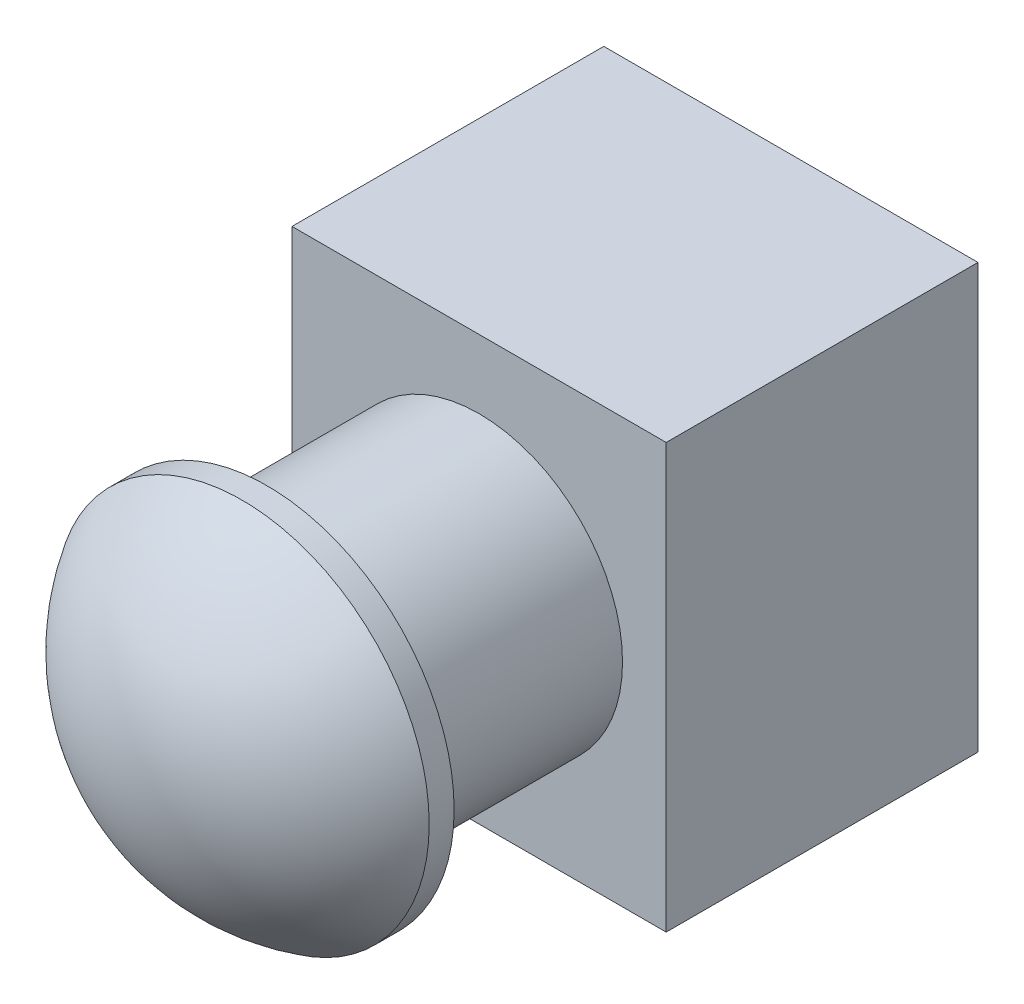
ISO-10303-21;
HEADER;
FILE_DESCRIPTION(('STEP AP214'),'2;1');
FILE_NAME('part.step','',(''),(''),'','','');
FILE_SCHEMA(('AUTOMOTIVE_DESIGN { 1 0 10303 214 1 1 1 1 }'));
ENDSEC;
DATA;
#1=APPLICATION_CONTEXT('core data for automotive mechanical design processes');
#2=APPLICATION_PROTOCOL_DEFINITION('international standard','automotive_design',2000,#1);
#3=PRODUCT_CONTEXT('',#1,'mechanical');
#4=PRODUCT('Part','Part','',(#3));
#5=PRODUCT_RELATED_PRODUCT_CATEGORY('part','',(#4));
#6=PRODUCT_DEFINITION_FORMATION('','',#4);
#7=PRODUCT_DEFINITION_CONTEXT('part definition',#1,'design');
#8=PRODUCT_DEFINITION('design','',#6,#7);
#9=PRODUCT_DEFINITION_SHAPE('','',#8);
#10=(LENGTH_UNIT() NAMED_UNIT(*) SI_UNIT(.MILLI.,.METRE.));
#11=(NAMED_UNIT(*) PLANE_ANGLE_UNIT() SI_UNIT($,.RADIAN.));
#12=(NAMED_UNIT(*) SI_UNIT($,.STERADIAN.) SOLID_ANGLE_UNIT());
#13=UNCERTAINTY_MEASURE_WITH_UNIT(LENGTH_MEASURE(1.E-05),#10,'distance_accuracy_value','');
#14=(GEOMETRIC_REPRESENTATION_CONTEXT(3) GLOBAL_UNCERTAINTY_ASSIGNED_CONTEXT((#13)) GLOBAL_UNIT_ASSIGNED_CONTEXT((#10,
#11,#12)) REPRESENTATION_CONTEXT('',''));
#15=CARTESIAN_POINT('',(0.,0.,0.));
#16=DIRECTION('',(0.,0.,1.));
#17=DIRECTION('',(1.,0.,0.));
#18=AXIS2_PLACEMENT_3D('',#15,#16,#17);
#19=CARTESIAN_POINT('',(15.,-17.,25.));
#20=DIRECTION('',(-1.,0.,0.));
#21=DIRECTION('',(0.,-1.,0.));
#22=AXIS2_PLACEMENT_3D('',#19,#20,#21);
#23=PLANE('',#22);
#24=DIRECTION('',(0.,1.,0.));
#25=VECTOR('',#24,1.);
#26=CARTESIAN_POINT('',(15.,-17.,0.));
#27=LINE('',#26,#25);
#28=CARTESIAN_POINT('',(15.,-17.,0.));
#29=VERTEX_POINT('',#28);
#30=CARTESIAN_POINT('',(15.,17.,0.));
#31=VERTEX_POINT('',#30);
#32=EDGE_CURVE('E101',#29,#31,#27,.T.);
#33=ORIENTED_EDGE('',*,*,#32,.T.);
#34=DIRECTION('',(0.,0.,-1.));
#35=VECTOR('',#34,1.);
#36=CARTESIAN_POINT('',(15.,17.,25.));
#37=LINE('',#36,#35);
#38=CARTESIAN_POINT('',(15.,17.,25.));
#39=VERTEX_POINT('',#38);
#40=EDGE_CURVE('E38',#39,#31,#37,.T.);
#41=ORIENTED_EDGE('',*,*,#40,.F.);
#42=DIRECTION('',(0.,1.,0.));
#43=VECTOR('',#42,1.);
#44=CARTESIAN_POINT('',(15.,-17.,25.));
#45=LINE('',#44,#43);
#46=CARTESIAN_POINT('',(15.,-17.,25.));
#47=VERTEX_POINT('',#46);
#48=EDGE_CURVE('E88',#47,#39,#45,.T.);
#49=ORIENTED_EDGE('',*,*,#48,.F.);
#50=DIRECTION('',(0.,0.,-1.));
#51=VECTOR('',#50,1.);
#52=CARTESIAN_POINT('',(15.,-17.,25.));
#53=LINE('',#52,#51);
#54=EDGE_CURVE('E97',#47,#29,#53,.T.);
#55=ORIENTED_EDGE('',*,*,#54,.T.);
#56=EDGE_LOOP('',(#33,#41,#49,#55));
#57=FACE_BOUND('',#56,.T.);
#58=ADVANCED_FACE('F35',(#57),#23,.F.);
#59=CARTESIAN_POINT('',(-15.,17.,25.));
#60=DIRECTION('',(0.,-1.,0.));
#61=DIRECTION('',(1.,0.,0.));
#62=AXIS2_PLACEMENT_3D('',#59,#60,#61);
#63=PLANE('',#62);
#64=DIRECTION('',(-1.,0.,0.));
#65=VECTOR('',#64,1.);
#66=CARTESIAN_POINT('',(-15.,17.,0.));
#67=LINE('',#66,#65);
#68=CARTESIAN_POINT('',(-15.,17.,0.));
#69=VERTEX_POINT('',#68);
#70=EDGE_CURVE('E93',#31,#69,#67,.T.);
#71=ORIENTED_EDGE('',*,*,#70,.T.);
#72=DIRECTION('',(0.,0.,-1.));
#73=VECTOR('',#72,1.);
#74=CARTESIAN_POINT('',(-15.,17.,25.));
#75=LINE('',#74,#73);
#76=CARTESIAN_POINT('',(-15.,17.,25.));
#77=VERTEX_POINT('',#76);
#78=EDGE_CURVE('E91',#77,#69,#75,.T.);
#79=ORIENTED_EDGE('',*,*,#78,.F.);
#80=DIRECTION('',(-1.,0.,0.));
#81=VECTOR('',#80,1.);
#82=CARTESIAN_POINT('',(-15.,17.,25.));
#83=LINE('',#82,#81);
#84=EDGE_CURVE('E83',#39,#77,#83,.T.);
#85=ORIENTED_EDGE('',*,*,#84,.F.);
#86=ORIENTED_EDGE('',*,*,#40,.T.);
#87=EDGE_LOOP('',(#71,#79,#85,#86));
#88=FACE_BOUND('',#87,.T.);
#89=ADVANCED_FACE('F92',(#88),#63,.F.);
#90=CARTESIAN_POINT('',(-15.,-17.,25.));
#91=DIRECTION('',(1.,0.,0.));
#92=DIRECTION('',(0.,1.,0.));
#93=AXIS2_PLACEMENT_3D('',#90,#91,#92);
#94=PLANE('',#93);
#95=DIRECTION('',(0.,-1.,0.));
#96=VECTOR('',#95,1.);
#97=CARTESIAN_POINT('',(-15.,-17.,0.));
#98=LINE('',#97,#96);
#99=CARTESIAN_POINT('',(-15.,-17.,0.));
#100=VERTEX_POINT('',#99);
#101=EDGE_CURVE('E69',#69,#100,#98,.T.);
#102=ORIENTED_EDGE('',*,*,#101,.T.);
#103=DIRECTION('',(0.,0.,-1.));
#104=VECTOR('',#103,1.);
#105=CARTESIAN_POINT('',(-15.,-17.,25.));
#106=LINE('',#105,#104);
#107=CARTESIAN_POINT('',(-15.,-17.,25.));
#108=VERTEX_POINT('',#107);
#109=EDGE_CURVE('E94',#108,#100,#106,.T.);
#110=ORIENTED_EDGE('',*,*,#109,.F.);
#111=DIRECTION('',(0.,-1.,0.));
#112=VECTOR('',#111,1.);
#113=CARTESIAN_POINT('',(-15.,-17.,25.));
#114=LINE('',#113,#112);
#115=EDGE_CURVE('E86',#77,#108,#114,.T.);
#116=ORIENTED_EDGE('',*,*,#115,.F.);
#117=ORIENTED_EDGE('',*,*,#78,.T.);
#118=EDGE_LOOP('',(#102,#110,#116,#117));
#119=FACE_BOUND('',#118,.T.);
#120=ADVANCED_FACE('F95',(#119),#94,.F.);
#121=CARTESIAN_POINT('',(-15.,-17.,25.));
#122=DIRECTION('',(0.,1.,0.));
#123=DIRECTION('',(-1.,0.,0.));
#124=AXIS2_PLACEMENT_3D('',#121,#122,#123);
#125=PLANE('',#124);
#126=DIRECTION('',(1.,0.,0.));
#127=VECTOR('',#126,1.);
#128=CARTESIAN_POINT('',(-15.,-17.,0.));
#129=LINE('',#128,#127);
#130=EDGE_CURVE('E75',#100,#29,#129,.T.);
#131=ORIENTED_EDGE('',*,*,#130,.T.);
#132=ORIENTED_EDGE('',*,*,#54,.F.);
#133=DIRECTION('',(1.,0.,0.));
#134=VECTOR('',#133,1.);
#135=CARTESIAN_POINT('',(-15.,-17.,25.));
#136=LINE('',#135,#134);
#137=EDGE_CURVE('E52',#108,#47,#136,.T.);
#138=ORIENTED_EDGE('',*,*,#137,.F.);
#139=ORIENTED_EDGE('',*,*,#109,.T.);
#140=EDGE_LOOP('',(#131,#132,#138,#139));
#141=FACE_BOUND('',#140,.T.);
#142=ADVANCED_FACE('F109',(#141),#125,.F.);
#143=CARTESIAN_POINT('',(0.,0.,25.));
#144=DIRECTION('',(0.,0.,-1.));
#145=DIRECTION('',(-1.,0.,0.));
#146=AXIS2_PLACEMENT_3D('',#143,#144,#145);
#147=PLANE('',#146);
#148=CARTESIAN_POINT('',(0.,0.,25.));
#149=DIRECTION('',(0.,0.,1.));
#150=DIRECTION('',(1.,0.,0.));
#151=AXIS2_PLACEMENT_3D('',#148,#149,#150);
#152=CIRCLE('',#151,11.5);
#153=CARTESIAN_POINT('',(11.5,0.,25.));
#154=VERTEX_POINT('',#153);
#155=EDGE_CURVE('E11',#154,#154,#152,.T.);
#156=ORIENTED_EDGE('',*,*,#155,.F.);
#157=EDGE_LOOP('',(#156));
#158=FACE_BOUND('',#157,.T.);
#159=ORIENTED_EDGE('',*,*,#48,.T.);
#160=ORIENTED_EDGE('',*,*,#84,.T.);
#161=ORIENTED_EDGE('',*,*,#115,.T.);
#162=ORIENTED_EDGE('',*,*,#137,.T.);
#163=EDGE_LOOP('',(#159,#160,#161,#162));
#164=FACE_BOUND('',#163,.T.);
#165=ADVANCED_FACE('F84',(#158,#164),#147,.F.);
#166=CARTESIAN_POINT('',(0.,0.,0.));
#167=DIRECTION('',(0.,0.,-1.));
#168=DIRECTION('',(-1.,0.,0.));
#169=AXIS2_PLACEMENT_3D('',#166,#167,#168);
#170=PLANE('',#169);
#171=ORIENTED_EDGE('',*,*,#32,.F.);
#172=ORIENTED_EDGE('',*,*,#130,.F.);
#173=ORIENTED_EDGE('',*,*,#101,.F.);
#174=ORIENTED_EDGE('',*,*,#70,.F.);
#175=EDGE_LOOP('',(#171,#172,#173,#174));
#176=FACE_BOUND('',#175,.T.);
#177=ADVANCED_FACE('F112',(#176),#170,.T.);
#178=CARTESIAN_POINT('',(0.,0.,42.));
#179=DIRECTION('',(0.,0.,-1.));
#180=DIRECTION('',(-1.,0.,0.));
#181=AXIS2_PLACEMENT_3D('',#178,#179,#180);
#182=CYLINDRICAL_SURFACE('',#181,11.5);
#183=CARTESIAN_POINT('',(0.,0.,42.));
#184=DIRECTION('',(0.,0.,1.));
#185=DIRECTION('',(1.,0.,0.));
#186=AXIS2_PLACEMENT_3D('',#183,#184,#185);
#187=CIRCLE('',#186,11.5);
#188=CARTESIAN_POINT('',(11.5,0.,42.));
#189=VERTEX_POINT('',#188);
#190=EDGE_CURVE('E104',#189,#189,#187,.T.);
#191=ORIENTED_EDGE('',*,*,#190,.F.);
#192=EDGE_LOOP('',(#191));
#193=FACE_BOUND('',#192,.T.);
#194=ORIENTED_EDGE('',*,*,#155,.T.);
#195=EDGE_LOOP('',(#194));
#196=FACE_BOUND('',#195,.T.);
#197=ADVANCED_FACE('F134',(#193,#196),#182,.T.);
#198=CARTESIAN_POINT('',(0.,0.,35.));
#199=DIRECTION('',(0.,0.,-1.));
#200=DIRECTION('',(1.,0.,0.));
#201=AXIS2_PLACEMENT_3D('',#198,#199,#200);
#202=SPHERICAL_SURFACE('',#201,17.4928556845359);
#203=CARTESIAN_POINT('',(0.,0.,44.));
#204=DIRECTION('',(0.,0.,-1.));
#205=DIRECTION('',(-1.,0.,0.));
#206=AXIS2_PLACEMENT_3D('',#203,#204,#205);
#207=CIRCLE('',#206,15.);
#208=CARTESIAN_POINT('',(-15.,0.,44.));
#209=VERTEX_POINT('',#208);
#210=EDGE_CURVE('E117',#209,#209,#207,.T.);
#211=ORIENTED_EDGE('',*,*,#210,.F.);
#212=EDGE_LOOP('',(#211));
#213=FACE_BOUND('',#212,.T.);
#214=ADVANCED_FACE('F129',(#213),#202,.T.);
#215=CARTESIAN_POINT('',(0.,0.,42.));
#216=DIRECTION('',(0.,0.,-1.));
#217=DIRECTION('',(-1.,0.,0.));
#218=AXIS2_PLACEMENT_3D('',#215,#216,#217);
#219=CYLINDRICAL_SURFACE('',#218,15.);
#220=CARTESIAN_POINT('',(0.,0.,42.));
#221=DIRECTION('',(0.,0.,-1.));
#222=DIRECTION('',(-1.,0.,0.));
#223=AXIS2_PLACEMENT_3D('',#220,#221,#222);
#224=CIRCLE('',#223,15.);
#225=CARTESIAN_POINT('',(-15.,0.,42.));
#226=VERTEX_POINT('',#225);
#227=EDGE_CURVE('E120',#226,#226,#224,.T.);
#228=ORIENTED_EDGE('',*,*,#227,.F.);
#229=EDGE_LOOP('',(#228));
#230=FACE_BOUND('',#229,.T.);
#231=ORIENTED_EDGE('',*,*,#210,.T.);
#232=EDGE_LOOP('',(#231));
#233=FACE_BOUND('',#232,.T.);
#234=ADVANCED_FACE('F126',(#230,#233),#219,.T.);
#235=CARTESIAN_POINT('',(0.,0.,42.));
#236=DIRECTION('',(0.,0.,1.));
#237=DIRECTION('',(1.,0.,0.));
#238=AXIS2_PLACEMENT_3D('',#235,#236,#237);
#239=PLANE('',#238);
#240=ORIENTED_EDGE('',*,*,#190,.T.);
#241=EDGE_LOOP('',(#240));
#242=FACE_BOUND('',#241,.T.);
#243=ORIENTED_EDGE('',*,*,#227,.T.);
#244=EDGE_LOOP('',(#243));
#245=FACE_BOUND('',#244,.T.);
#246=ADVANCED_FACE('F124',(#242,#245),#239,.F.);
#247=CLOSED_SHELL('',(#58,#89,#120,#142,#165,#177,#197,#214,#234,#246));
#248=MANIFOLD_SOLID_BREP('B2',#247);
#249=ADVANCED_BREP_SHAPE_REPRESENTATION('',(#18,#248),#14);
#250=SHAPE_DEFINITION_REPRESENTATION(#9,#249);
ENDSEC;
END-ISO-10303-21;
